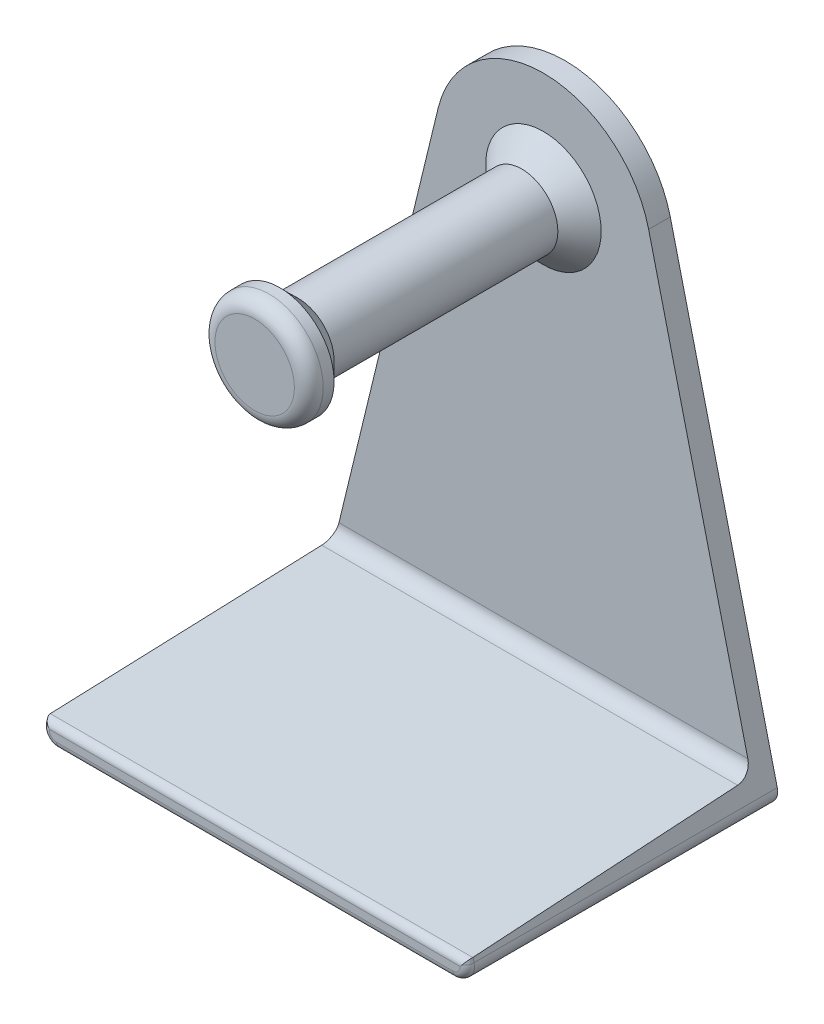
ISO-10303-21;
HEADER;
FILE_DESCRIPTION(('STEP AP214'),'2;1');
FILE_NAME('part.step','',(''),(''),'','','');
FILE_SCHEMA(('AUTOMOTIVE_DESIGN { 1 0 10303 214 1 1 1 1 }'));
ENDSEC;
DATA;
#1=APPLICATION_CONTEXT('core data for automotive mechanical design processes');
#2=APPLICATION_PROTOCOL_DEFINITION('international standard','automotive_design',2000,#1);
#3=PRODUCT_CONTEXT('',#1,'mechanical');
#4=PRODUCT('Part','Part','',(#3));
#5=PRODUCT_RELATED_PRODUCT_CATEGORY('part','',(#4));
#6=PRODUCT_DEFINITION_FORMATION('','',#4);
#7=PRODUCT_DEFINITION_CONTEXT('part definition',#1,'design');
#8=PRODUCT_DEFINITION('design','',#6,#7);
#9=PRODUCT_DEFINITION_SHAPE('','',#8);
#10=(LENGTH_UNIT() NAMED_UNIT(*) SI_UNIT(.MILLI.,.METRE.));
#11=(NAMED_UNIT(*) PLANE_ANGLE_UNIT() SI_UNIT($,.RADIAN.));
#12=(NAMED_UNIT(*) SI_UNIT($,.STERADIAN.) SOLID_ANGLE_UNIT());
#13=UNCERTAINTY_MEASURE_WITH_UNIT(LENGTH_MEASURE(1.E-05),#10,'distance_accuracy_value','');
#14=(GEOMETRIC_REPRESENTATION_CONTEXT(3) GLOBAL_UNCERTAINTY_ASSIGNED_CONTEXT((#13)) GLOBAL_UNIT_ASSIGNED_CONTEXT((#10,
#11,#12)) REPRESENTATION_CONTEXT('',''));
#15=CARTESIAN_POINT('',(0.,0.,0.));
#16=DIRECTION('',(0.,0.,1.));
#17=DIRECTION('',(1.,0.,0.));
#18=AXIS2_PLACEMENT_3D('',#15,#16,#17);
#19=CARTESIAN_POINT('',(30.,-57.,43.));
#20=DIRECTION('',(0.,-0.998752338877845,-0.0499376169438923));
#21=DIRECTION('',(0.,0.0499376169438923,-0.998752338877845));
#22=AXIS2_PLACEMENT_3D('',#19,#20,#21);
#23=PLANE('',#22);
#24=DIRECTION('',(-1.,0.,0.));
#25=VECTOR('',#24,1.);
#26=CARTESIAN_POINT('',(29.2717797887081,-56.9524968808472,42.0499376169439));
#27=LINE('',#26,#25);
#28=CARTESIAN_POINT('',(-29.2589649853697,-56.9524968808472,42.0499376169439));
#29=VERTEX_POINT('',#28);
#30=CARTESIAN_POINT('',(29.2589649853697,-56.9524968808472,42.0499376169439));
#31=VERTEX_POINT('',#30);
#32=EDGE_CURVE('E276',#29,#31,#27,.F.);
#33=ORIENTED_EDGE('',*,*,#32,.T.);
#34=CARTESIAN_POINT('',(28.2306030669091,-56.95,42.));
#35=DIRECTION('',(0.,-0.998752338877845,-0.0499376169438923));
#36=DIRECTION('',(0.979487540364529,-0.0100626662741666,0.201253325483332));
#37=AXIS2_PLACEMENT_3D('',#34,#35,#36);
#38=ELLIPSE('',#37,1.03032521499143,1.);
#39=CARTESIAN_POINT('',(29.2596427851866,-56.95,42.));
#40=VERTEX_POINT('',#39);
#41=EDGE_CURVE('E282',#31,#40,#38,.F.);
#42=ORIENTED_EDGE('',*,*,#41,.T.);
#43=DIRECTION('',(0.0121209701621265,-0.0499339484437978,0.998678968875955));
#44=VECTOR('',#43,1.);
#45=CARTESIAN_POINT('',(29.2718867773052,-57.000440753753,43.0088150750603));
#46=LINE('',#45,#44);
#47=CARTESIAN_POINT('',(28.8093614688246,-55.0950062383056,4.90012476611221));
#48=VERTEX_POINT('',#47);
#49=EDGE_CURVE('E244',#48,#40,#46,.T.);
#50=ORIENTED_EDGE('',*,*,#49,.F.);
#51=DIRECTION('',(-1.,0.,0.));
#52=VECTOR('',#51,1.);
#53=CARTESIAN_POINT('',(30.,-55.0950062383056,4.90012476611221));
#54=LINE('',#53,#52);
#55=CARTESIAN_POINT('',(-28.8093614688245,-55.0950062383056,4.90012476611221));
#56=VERTEX_POINT('',#55);
#57=EDGE_CURVE('E252',#48,#56,#54,.T.);
#58=ORIENTED_EDGE('',*,*,#57,.T.);
#59=DIRECTION('',(-0.0121209701621265,-0.0499339484437978,0.998678968875955));
#60=VECTOR('',#59,1.);
#61=CARTESIAN_POINT('',(-29.2630717022449,-56.9641258798031,42.2825175960629));
#62=LINE('',#61,#60);
#63=CARTESIAN_POINT('',(-29.2596427851866,-56.95,42.));
#64=VERTEX_POINT('',#63);
#65=EDGE_CURVE('E248',#56,#64,#62,.T.);
#66=ORIENTED_EDGE('',*,*,#65,.T.);
#67=CARTESIAN_POINT('',(-28.2306030669091,-56.95,42.));
#68=DIRECTION('',(0.,-0.998752338877845,-0.0499376169438923));
#69=DIRECTION('',(0.979487540364529,0.0100626662741666,-0.201253325483333));
#70=AXIS2_PLACEMENT_3D('',#67,#68,#69);
#71=ELLIPSE('',#70,1.03032521499143,1.);
#72=EDGE_CURVE('E279',#64,#29,#71,.F.);
#73=ORIENTED_EDGE('',*,*,#72,.T.);
#74=EDGE_LOOP('',(#33,#42,#50,#58,#66,#73));
#75=FACE_BOUND('',#74,.T.);
#76=ADVANCED_FACE('F78',(#75),#23,.F.);
#77=CARTESIAN_POINT('',(-27.4564404225837,-58.,3.));
#78=DIRECTION('',(0.,0.,1.));
#79=DIRECTION('',(1.,0.,0.));
#80=AXIS2_PLACEMENT_3D('',#77,#78,#79);
#81=PLANE('',#80);
#82=CARTESIAN_POINT('',(0.,0.,3.));
#83=DIRECTION('',(0.,0.,1.));
#84=DIRECTION('',(1.,0.,0.));
#85=AXIS2_PLACEMENT_3D('',#82,#83,#84);
#86=CIRCLE('',#85,7.99999999999998);
#87=CARTESIAN_POINT('',(7.99999999999998,0.,3.));
#88=VERTEX_POINT('',#87);
#89=EDGE_CURVE('E236',#88,#88,#86,.F.);
#90=ORIENTED_EDGE('',*,*,#89,.T.);
#91=EDGE_LOOP('',(#90));
#92=FACE_BOUND('',#91,.T.);
#93=DIRECTION('',(-0.235889894354067,-0.971779788708135,0.));
#94=VECTOR('',#93,1.);
#95=CARTESIAN_POINT('',(-14.576696830622,3.53834841531101,3.));
#96=LINE('',#95,#94);
#97=CARTESIAN_POINT('',(-14.576696830622,3.53834841531101,3.));
#98=VERTEX_POINT('',#97);
#99=CARTESIAN_POINT('',(-28.3244870426606,-53.0975015605499,3.));
#100=VERTEX_POINT('',#99);
#101=EDGE_CURVE('E437',#98,#100,#96,.T.);
#102=ORIENTED_EDGE('',*,*,#101,.T.);
#103=DIRECTION('',(-1.,0.,0.));
#104=VECTOR('',#103,1.);
#105=CARTESIAN_POINT('',(-27.4564404225837,-53.0975015605499,3.));
#106=LINE('',#105,#104);
#107=CARTESIAN_POINT('',(28.3244870426606,-53.0975015605499,3.));
#108=VERTEX_POINT('',#107);
#109=EDGE_CURVE('E256',#100,#108,#106,.F.);
#110=ORIENTED_EDGE('',*,*,#109,.T.);
#111=DIRECTION('',(-0.235889894354067,0.971779788708135,0.));
#112=VECTOR('',#111,1.);
#113=CARTESIAN_POINT('',(14.576696830622,3.53834841531101,3.));
#114=LINE('',#113,#112);
#115=CARTESIAN_POINT('',(14.576696830622,3.53834841531101,3.));
#116=VERTEX_POINT('',#115);
#117=EDGE_CURVE('E410',#108,#116,#114,.T.);
#118=ORIENTED_EDGE('',*,*,#117,.T.);
#119=CARTESIAN_POINT('',(0.,0.,3.));
#120=DIRECTION('',(0.,0.,1.));
#121=DIRECTION('',(1.,0.,0.));
#122=AXIS2_PLACEMENT_3D('',#119,#120,#121);
#123=CIRCLE('',#122,15.);
#124=EDGE_CURVE('E444',#116,#98,#123,.T.);
#125=ORIENTED_EDGE('',*,*,#124,.T.);
#126=EDGE_LOOP('',(#102,#110,#118,#125));
#127=FACE_BOUND('',#126,.T.);
#128=ADVANCED_FACE('F337',(#92,#127),#81,.T.);
#129=CARTESIAN_POINT('',(0.,0.,43.));
#130=DIRECTION('',(0.,0.,-1.));
#131=DIRECTION('',(-1.,0.,0.));
#132=AXIS2_PLACEMENT_3D('',#129,#130,#131);
#133=CYLINDRICAL_SURFACE('',#132,5.);
#134=CARTESIAN_POINT('',(0.,0.,37.));
#135=DIRECTION('',(0.,0.,1.));
#136=DIRECTION('',(1.,0.,0.));
#137=AXIS2_PLACEMENT_3D('',#134,#135,#136);
#138=CIRCLE('',#137,5.);
#139=CARTESIAN_POINT('',(5.,0.,37.));
#140=VERTEX_POINT('',#139);
#141=EDGE_CURVE('E232',#140,#140,#138,.F.);
#142=ORIENTED_EDGE('',*,*,#141,.T.);
#143=EDGE_LOOP('',(#142));
#144=FACE_BOUND('',#143,.T.);
#145=CARTESIAN_POINT('',(0.,0.,6.00000000000001));
#146=DIRECTION('',(0.,0.,1.));
#147=DIRECTION('',(1.,0.,0.));
#148=AXIS2_PLACEMENT_3D('',#145,#146,#147);
#149=CIRCLE('',#148,5.);
#150=CARTESIAN_POINT('',(5.,0.,6.00000000000001));
#151=VERTEX_POINT('',#150);
#152=EDGE_CURVE('E223',#151,#151,#149,.T.);
#153=ORIENTED_EDGE('',*,*,#152,.T.);
#154=EDGE_LOOP('',(#153));
#155=FACE_BOUND('',#154,.T.);
#156=ADVANCED_FACE('F345',(#144,#155),#133,.T.);
#157=CARTESIAN_POINT('',(-27.4564404225837,-58.,3.));
#158=DIRECTION('',(0.,0.,-1.));
#159=DIRECTION('',(-1.,0.,0.));
#160=AXIS2_PLACEMENT_3D('',#157,#158,#159);
#161=CYLINDRICAL_SURFACE('',#160,2.);
#162=DIRECTION('',(0.,0.,-1.));
#163=VECTOR('',#162,1.);
#164=CARTESIAN_POINT('',(-27.4564404225837,-60.,3.));
#165=LINE('',#164,#163);
#166=CARTESIAN_POINT('',(-27.4564404225837,-60.,42.));
#167=VERTEX_POINT('',#166);
#168=CARTESIAN_POINT('',(-27.4564404225837,-60.,0.));
#169=VERTEX_POINT('',#168);
#170=EDGE_CURVE('E123',#167,#169,#165,.T.);
#171=ORIENTED_EDGE('',*,*,#170,.F.);
#172=CARTESIAN_POINT('',(-27.4564404225837,-58.,42.));
#173=DIRECTION('',(0.,0.,1.));
#174=DIRECTION('',(1.,0.,0.));
#175=AXIS2_PLACEMENT_3D('',#172,#173,#174);
#176=CIRCLE('',#175,2.);
#177=CARTESIAN_POINT('',(-29.4,-57.5282202112919,42.));
#178=VERTEX_POINT('',#177);
#179=EDGE_CURVE('E96',#167,#178,#176,.F.);
#180=ORIENTED_EDGE('',*,*,#179,.T.);
#181=DIRECTION('',(0.,0.,-1.));
#182=VECTOR('',#181,1.);
#183=CARTESIAN_POINT('',(-29.4,-57.5282202112919,3.));
#184=LINE('',#183,#182);
#185=CARTESIAN_POINT('',(-29.4,-57.5282202112919,0.));
#186=VERTEX_POINT('',#185);
#187=EDGE_CURVE('E433',#178,#186,#184,.T.);
#188=ORIENTED_EDGE('',*,*,#187,.T.);
#189=CARTESIAN_POINT('',(-27.4564404225837,-58.,0.));
#190=DIRECTION('',(0.,0.,1.));
#191=DIRECTION('',(1.,0.,0.));
#192=AXIS2_PLACEMENT_3D('',#189,#190,#191);
#193=CIRCLE('',#192,2.);
#194=EDGE_CURVE('E454',#186,#169,#193,.T.);
#195=ORIENTED_EDGE('',*,*,#194,.T.);
#196=EDGE_LOOP('',(#171,#180,#188,#195));
#197=FACE_BOUND('',#196,.T.);
#198=ADVANCED_FACE('F365',(#197),#161,.T.);
#199=CARTESIAN_POINT('',(-27.4564404225837,-60.,3.));
#200=DIRECTION('',(0.,1.,0.));
#201=DIRECTION('',(-1.,0.,0.));
#202=AXIS2_PLACEMENT_3D('',#199,#200,#201);
#203=PLANE('',#202);
#204=DIRECTION('',(0.,0.,-1.));
#205=VECTOR('',#204,1.);
#206=CARTESIAN_POINT('',(27.4564404225837,-60.,3.));
#207=LINE('',#206,#205);
#208=CARTESIAN_POINT('',(27.4564404225837,-60.,42.));
#209=VERTEX_POINT('',#208);
#210=CARTESIAN_POINT('',(27.4564404225837,-60.,0.));
#211=VERTEX_POINT('',#210);
#212=EDGE_CURVE('E211',#209,#211,#207,.T.);
#213=ORIENTED_EDGE('',*,*,#212,.F.);
#214=DIRECTION('',(1.,0.,0.));
#215=VECTOR('',#214,1.);
#216=CARTESIAN_POINT('',(-27.4564404225837,-60.,42.));
#217=LINE('',#216,#215);
#218=EDGE_CURVE('E200',#209,#167,#217,.F.);
#219=ORIENTED_EDGE('',*,*,#218,.T.);
#220=ORIENTED_EDGE('',*,*,#170,.T.);
#221=DIRECTION('',(1.,0.,0.));
#222=VECTOR('',#221,1.);
#223=CARTESIAN_POINT('',(-27.4564404225837,-60.,0.));
#224=LINE('',#223,#222);
#225=EDGE_CURVE('E217',#169,#211,#224,.T.);
#226=ORIENTED_EDGE('',*,*,#225,.T.);
#227=EDGE_LOOP('',(#213,#219,#220,#226));
#228=FACE_BOUND('',#227,.T.);
#229=ADVANCED_FACE('F216',(#228),#203,.F.);
#230=CARTESIAN_POINT('',(27.4564404225837,-58.,3.));
#231=DIRECTION('',(0.,0.,-1.));
#232=DIRECTION('',(-1.,0.,0.));
#233=AXIS2_PLACEMENT_3D('',#230,#231,#232);
#234=CYLINDRICAL_SURFACE('',#233,2.);
#235=DIRECTION('',(0.,0.,-1.));
#236=VECTOR('',#235,1.);
#237=CARTESIAN_POINT('',(29.4,-57.5282202112919,3.));
#238=LINE('',#237,#236);
#239=CARTESIAN_POINT('',(29.4,-57.5282202112919,42.));
#240=VERTEX_POINT('',#239);
#241=CARTESIAN_POINT('',(29.4,-57.5282202112919,0.));
#242=VERTEX_POINT('',#241);
#243=EDGE_CURVE('E212',#240,#242,#238,.T.);
#244=ORIENTED_EDGE('',*,*,#243,.F.);
#245=CARTESIAN_POINT('',(27.4564404225837,-58.,42.));
#246=DIRECTION('',(0.,0.,1.));
#247=DIRECTION('',(1.,0.,0.));
#248=AXIS2_PLACEMENT_3D('',#245,#246,#247);
#249=CIRCLE('',#248,2.);
#250=EDGE_CURVE('E191',#240,#209,#249,.F.);
#251=ORIENTED_EDGE('',*,*,#250,.T.);
#252=ORIENTED_EDGE('',*,*,#212,.T.);
#253=CARTESIAN_POINT('',(27.4564404225837,-58.,0.));
#254=DIRECTION('',(0.,0.,1.));
#255=DIRECTION('',(-1.,0.,0.));
#256=AXIS2_PLACEMENT_3D('',#253,#254,#255);
#257=CIRCLE('',#256,2.);
#258=EDGE_CURVE('E416',#211,#242,#257,.T.);
#259=ORIENTED_EDGE('',*,*,#258,.T.);
#260=EDGE_LOOP('',(#244,#251,#252,#259));
#261=FACE_BOUND('',#260,.T.);
#262=ADVANCED_FACE('F209',(#261),#234,.T.);
#263=CARTESIAN_POINT('',(14.576696830622,3.53834841531101,3.));
#264=DIRECTION('',(-0.971779788708135,-0.235889894354067,0.));
#265=DIRECTION('',(0.235889894354067,-0.971779788708135,0.));
#266=AXIS2_PLACEMENT_3D('',#263,#264,#265);
#267=PLANE('',#266);
#268=ORIENTED_EDGE('',*,*,#49,.T.);
#269=DIRECTION('',(-0.235889894354067,0.971779788708135,0.));
#270=VECTOR('',#269,1.);
#271=CARTESIAN_POINT('',(29.8584660633876,-59.4169321267751,42.));
#272=LINE('',#271,#270);
#273=EDGE_CURVE('E214',#40,#240,#272,.F.);
#274=ORIENTED_EDGE('',*,*,#273,.T.);
#275=ORIENTED_EDGE('',*,*,#243,.T.);
#276=DIRECTION('',(-0.235889894354067,0.971779788708135,0.));
#277=VECTOR('',#276,1.);
#278=CARTESIAN_POINT('',(14.576696830622,3.53834841531101,0.));
#279=LINE('',#278,#277);
#280=CARTESIAN_POINT('',(14.576696830622,3.53834841531101,0.));
#281=VERTEX_POINT('',#280);
#282=EDGE_CURVE('E414',#242,#281,#279,.T.);
#283=ORIENTED_EDGE('',*,*,#282,.T.);
#284=DIRECTION('',(0.,0.,-1.));
#285=VECTOR('',#284,1.);
#286=CARTESIAN_POINT('',(14.576696830622,3.53834841531101,3.));
#287=LINE('',#286,#285);
#288=EDGE_CURVE('E225',#116,#281,#287,.T.);
#289=ORIENTED_EDGE('',*,*,#288,.F.);
#290=ORIENTED_EDGE('',*,*,#117,.F.);
#291=CARTESIAN_POINT('',(28.3244870426606,-53.0975015605499,5.));
#292=DIRECTION('',(-0.971779788708135,-0.235889894354067,0.));
#293=DIRECTION('',(-0.235889894354067,0.971779788708135,0.));
#294=AXIS2_PLACEMENT_3D('',#291,#292,#293);
#295=ELLIPSE('',#294,2.05807943655503,2.);
#296=EDGE_CURVE('E262',#108,#48,#295,.T.);
#297=ORIENTED_EDGE('',*,*,#296,.T.);
#298=EDGE_LOOP('',(#268,#274,#275,#283,#289,#290,#297));
#299=FACE_BOUND('',#298,.T.);
#300=ADVANCED_FACE('F378',(#299),#267,.F.);
#301=CARTESIAN_POINT('',(0.,0.,3.));
#302=DIRECTION('',(0.,0.,-1.));
#303=DIRECTION('',(-1.,0.,0.));
#304=AXIS2_PLACEMENT_3D('',#301,#302,#303);
#305=CYLINDRICAL_SURFACE('',#304,15.);
#306=CARTESIAN_POINT('',(0.,0.,0.));
#307=DIRECTION('',(0.,0.,1.));
#308=DIRECTION('',(1.,0.,0.));
#309=AXIS2_PLACEMENT_3D('',#306,#307,#308);
#310=CIRCLE('',#309,15.);
#311=CARTESIAN_POINT('',(-14.576696830622,3.53834841531101,0.));
#312=VERTEX_POINT('',#311);
#313=EDGE_CURVE('E422',#281,#312,#310,.T.);
#314=ORIENTED_EDGE('',*,*,#313,.T.);
#315=DIRECTION('',(0.,0.,-1.));
#316=VECTOR('',#315,1.);
#317=CARTESIAN_POINT('',(-14.576696830622,3.53834841531101,3.));
#318=LINE('',#317,#316);
#319=EDGE_CURVE('E436',#98,#312,#318,.T.);
#320=ORIENTED_EDGE('',*,*,#319,.F.);
#321=ORIENTED_EDGE('',*,*,#124,.F.);
#322=ORIENTED_EDGE('',*,*,#288,.T.);
#323=EDGE_LOOP('',(#314,#320,#321,#322));
#324=FACE_BOUND('',#323,.T.);
#325=ADVANCED_FACE('F374',(#324),#305,.T.);
#326=CARTESIAN_POINT('',(-14.576696830622,3.53834841531101,3.));
#327=DIRECTION('',(0.971779788708135,-0.235889894354067,0.));
#328=DIRECTION('',(0.235889894354067,0.971779788708135,0.));
#329=AXIS2_PLACEMENT_3D('',#326,#327,#328);
#330=PLANE('',#329);
#331=ORIENTED_EDGE('',*,*,#187,.F.);
#332=DIRECTION('',(-0.235889894354067,-0.971779788708135,0.));
#333=VECTOR('',#332,1.);
#334=CARTESIAN_POINT('',(-29.4,-57.5282202112919,42.));
#335=LINE('',#334,#333);
#336=EDGE_CURVE('E289',#178,#64,#335,.F.);
#337=ORIENTED_EDGE('',*,*,#336,.T.);
#338=ORIENTED_EDGE('',*,*,#65,.F.);
#339=CARTESIAN_POINT('',(-28.3244870426606,-53.0975015605499,5.));
#340=DIRECTION('',(0.971779788708135,-0.235889894354067,0.));
#341=DIRECTION('',(-0.235889894354067,-0.971779788708135,0.));
#342=AXIS2_PLACEMENT_3D('',#339,#340,#341);
#343=ELLIPSE('',#342,2.05807943655503,2.);
#344=EDGE_CURVE('E259',#56,#100,#343,.T.);
#345=ORIENTED_EDGE('',*,*,#344,.T.);
#346=ORIENTED_EDGE('',*,*,#101,.F.);
#347=ORIENTED_EDGE('',*,*,#319,.T.);
#348=DIRECTION('',(-0.235889894354067,-0.971779788708135,0.));
#349=VECTOR('',#348,1.);
#350=CARTESIAN_POINT('',(-14.576696830622,3.53834841531101,0.));
#351=LINE('',#350,#349);
#352=EDGE_CURVE('E426',#312,#186,#351,.T.);
#353=ORIENTED_EDGE('',*,*,#352,.T.);
#354=EDGE_LOOP('',(#331,#337,#338,#345,#346,#347,#353));
#355=FACE_BOUND('',#354,.T.);
#356=ADVANCED_FACE('F370',(#355),#330,.F.);
#357=CARTESIAN_POINT('',(-27.4564404225837,-58.,0.));
#358=DIRECTION('',(0.,0.,1.));
#359=DIRECTION('',(1.,0.,0.));
#360=AXIS2_PLACEMENT_3D('',#357,#358,#359);
#361=PLANE('',#360);
#362=ORIENTED_EDGE('',*,*,#194,.F.);
#363=ORIENTED_EDGE('',*,*,#352,.F.);
#364=ORIENTED_EDGE('',*,*,#313,.F.);
#365=ORIENTED_EDGE('',*,*,#282,.F.);
#366=ORIENTED_EDGE('',*,*,#258,.F.);
#367=ORIENTED_EDGE('',*,*,#225,.F.);
#368=EDGE_LOOP('',(#362,#363,#364,#365,#366,#367));
#369=FACE_BOUND('',#368,.T.);
#370=ADVANCED_FACE('F358',(#369),#361,.F.);
#371=CARTESIAN_POINT('',(0.,0.,40.));
#372=DIRECTION('',(0.,0.,1.));
#373=DIRECTION('',(1.,0.,0.));
#374=AXIS2_PLACEMENT_3D('',#371,#372,#373);
#375=CYLINDRICAL_SURFACE('',#374,7.5);
#376=CARTESIAN_POINT('',(0.,0.,41.));
#377=DIRECTION('',(0.,0.,1.));
#378=DIRECTION('',(1.,0.,0.));
#379=AXIS2_PLACEMENT_3D('',#376,#377,#378);
#380=CIRCLE('',#379,7.5);
#381=CARTESIAN_POINT('',(7.5,0.,41.));
#382=VERTEX_POINT('',#381);
#383=EDGE_CURVE('E13',#382,#382,#380,.F.);
#384=ORIENTED_EDGE('',*,*,#383,.T.);
#385=EDGE_LOOP('',(#384));
#386=FACE_BOUND('',#385,.T.);
#387=CARTESIAN_POINT('',(0.,0.,39.5));
#388=DIRECTION('',(0.,0.,1.));
#389=DIRECTION('',(1.,0.,0.));
#390=AXIS2_PLACEMENT_3D('',#387,#388,#389);
#391=CIRCLE('',#390,7.5);
#392=CARTESIAN_POINT('',(7.49999999999999,0.,39.4999999999999));
#393=VERTEX_POINT('',#392);
#394=EDGE_CURVE('E240',#393,#393,#391,.T.);
#395=ORIENTED_EDGE('',*,*,#394,.T.);
#396=EDGE_LOOP('',(#395));
#397=FACE_BOUND('',#396,.T.);
#398=ADVANCED_FACE('F354',(#386,#397),#375,.T.);
#399=CARTESIAN_POINT('',(0.,0.,43.));
#400=DIRECTION('',(0.,0.,1.));
#401=DIRECTION('',(1.,0.,0.));
#402=AXIS2_PLACEMENT_3D('',#399,#400,#401);
#403=PLANE('',#402);
#404=CARTESIAN_POINT('',(0.,0.,43.));
#405=DIRECTION('',(0.,0.,1.));
#406=DIRECTION('',(1.,0.,0.));
#407=AXIS2_PLACEMENT_3D('',#404,#405,#406);
#408=CIRCLE('',#407,5.5);
#409=CARTESIAN_POINT('',(5.5,0.,43.));
#410=VERTEX_POINT('',#409);
#411=EDGE_CURVE('E88',#410,#410,#408,.T.);
#412=ORIENTED_EDGE('',*,*,#411,.T.);
#413=EDGE_LOOP('',(#412));
#414=FACE_BOUND('',#413,.T.);
#415=ADVANCED_FACE('F357',(#414),#403,.T.);
#416=CARTESIAN_POINT('',(0.,0.,40.));
#417=DIRECTION('',(0.,0.,1.));
#418=DIRECTION('',(1.,0.,0.));
#419=AXIS2_PLACEMENT_3D('',#416,#417,#418);
#420=CONICAL_SURFACE('',#419,8.00000000000005,0.785398163397453);
#421=CARTESIAN_POINT('',(5.,0.,37.));
#422=CARTESIAN_POINT('',(5.02604166666666,0.,37.0260416666666));
#423=CARTESIAN_POINT('',(5.05208333333333,0.,37.0520833333333));
#424=CARTESIAN_POINT('',(5.10416666666666,0.,37.1041666666666));
#425=CARTESIAN_POINT('',(5.13020833333333,0.,37.1302083333333));
#426=CARTESIAN_POINT('',(5.18229166666666,0.,37.1822916666666));
#427=CARTESIAN_POINT('',(5.20833333333333,0.,37.2083333333333));
#428=CARTESIAN_POINT('',(5.26041666666666,0.,37.2604166666666));
#429=CARTESIAN_POINT('',(5.28645833333333,0.,37.2864583333333));
#430=CARTESIAN_POINT('',(5.33854166666666,0.,37.3385416666666));
#431=CARTESIAN_POINT('',(5.36458333333333,0.,37.3645833333333));
#432=CARTESIAN_POINT('',(5.41666666666666,0.,37.4166666666666));
#433=CARTESIAN_POINT('',(5.44270833333333,0.,37.4427083333333));
#434=CARTESIAN_POINT('',(5.49479166666666,0.,37.4947916666666));
#435=CARTESIAN_POINT('',(5.52083333333333,0.,37.5208333333333));
#436=CARTESIAN_POINT('',(5.57291666666666,0.,37.5729166666666));
#437=CARTESIAN_POINT('',(5.59895833333333,0.,37.5989583333333));
#438=CARTESIAN_POINT('',(5.65104166666666,0.,37.6510416666666));
#439=CARTESIAN_POINT('',(5.67708333333333,0.,37.6770833333333));
#440=CARTESIAN_POINT('',(5.72916666666666,0.,37.7291666666666));
#441=CARTESIAN_POINT('',(5.75520833333333,0.,37.7552083333333));
#442=CARTESIAN_POINT('',(5.80729166666666,0.,37.8072916666666));
#443=CARTESIAN_POINT('',(5.83333333333333,0.,37.8333333333333));
#444=CARTESIAN_POINT('',(5.88541666666666,0.,37.8854166666666));
#445=CARTESIAN_POINT('',(5.91145833333333,0.,37.9114583333333));
#446=CARTESIAN_POINT('',(5.96354166666666,0.,37.9635416666666));
#447=CARTESIAN_POINT('',(5.98958333333333,0.,37.9895833333333));
#448=CARTESIAN_POINT('',(6.04166666666666,0.,38.0416666666666));
#449=CARTESIAN_POINT('',(6.06770833333333,0.,38.0677083333333));
#450=CARTESIAN_POINT('',(6.11979166666666,0.,38.1197916666666));
#451=CARTESIAN_POINT('',(6.14583333333333,0.,38.1458333333333));
#452=CARTESIAN_POINT('',(6.19791666666666,0.,38.1979166666666));
#453=CARTESIAN_POINT('',(6.22395833333333,0.,38.2239583333333));
#454=CARTESIAN_POINT('',(6.27604166666666,0.,38.2760416666666));
#455=CARTESIAN_POINT('',(6.30208333333333,0.,38.3020833333333));
#456=CARTESIAN_POINT('',(6.35416666666666,0.,38.3541666666666));
#457=CARTESIAN_POINT('',(6.38020833333333,0.,38.3802083333333));
#458=CARTESIAN_POINT('',(6.43229166666666,0.,38.4322916666666));
#459=CARTESIAN_POINT('',(6.45833333333333,0.,38.4583333333333));
#460=CARTESIAN_POINT('',(6.51041666666666,0.,38.5104166666666));
#461=CARTESIAN_POINT('',(6.53645833333333,0.,38.5364583333333));
#462=CARTESIAN_POINT('',(6.58854166666666,0.,38.5885416666666));
#463=CARTESIAN_POINT('',(6.61458333333333,0.,38.6145833333333));
#464=CARTESIAN_POINT('',(6.66666666666666,0.,38.6666666666666));
#465=CARTESIAN_POINT('',(6.69270833333333,0.,38.6927083333333));
#466=CARTESIAN_POINT('',(6.74479166666666,0.,38.7447916666666));
#467=CARTESIAN_POINT('',(6.77083333333333,0.,38.7708333333333));
#468=CARTESIAN_POINT('',(6.82291666666666,0.,38.8229166666666));
#469=CARTESIAN_POINT('',(6.84895833333333,0.,38.8489583333333));
#470=CARTESIAN_POINT('',(6.90104166666666,0.,38.9010416666666));
#471=CARTESIAN_POINT('',(6.92708333333333,0.,38.9270833333333));
#472=CARTESIAN_POINT('',(6.97916666666666,0.,38.9791666666666));
#473=CARTESIAN_POINT('',(7.00520833333333,0.,39.0052083333333));
#474=CARTESIAN_POINT('',(7.05729166666666,0.,39.0572916666666));
#475=CARTESIAN_POINT('',(7.08333333333333,0.,39.0833333333333));
#476=CARTESIAN_POINT('',(7.13541666666666,0.,39.1354166666666));
#477=CARTESIAN_POINT('',(7.16145833333333,0.,39.1614583333333));
#478=CARTESIAN_POINT('',(7.21354166666666,0.,39.2135416666666));
#479=CARTESIAN_POINT('',(7.23958333333333,0.,39.2395833333333));
#480=CARTESIAN_POINT('',(7.29166666666666,0.,39.2916666666666));
#481=CARTESIAN_POINT('',(7.31770833333333,0.,39.3177083333333));
#482=CARTESIAN_POINT('',(7.36979166666666,0.,39.3697916666666));
#483=CARTESIAN_POINT('',(7.39583333333333,0.,39.3958333333333));
#484=CARTESIAN_POINT('',(7.44791666666666,0.,39.4479166666666));
#485=CARTESIAN_POINT('',(7.47395833333333,0.,39.4739583333333));
#486=CARTESIAN_POINT('',(7.49999999999999,0.,39.5));
#487=B_SPLINE_CURVE_WITH_KNOTS('',3,(#421,#422,#423,#424,#425,#426,#427,#428,#429,#430,#431,
#432,#433,#434,#435,#436,#437,#438,#439,#440,#441,#442,#443,#444,#445,#446,#447,#448,#449,#450,
#451,#452,#453,#454,#455,#456,#457,#458,#459,#460,#461,#462,#463,#464,#465,#466,#467,#468,#469,
#470,#471,#472,#473,#474,#475,#476,#477,#478,#479,#480,#481,#482,#483,#484,#485,#486),
.UNSPECIFIED.,.F.,.F.,(4,2,2,2,2,2,2,2,2,2,2,2,2,2,2,2,2,2,2,2,2,2,2,2,2,2,2,2,2,2,2,2,4),(0.,
0.110485434560402,0.220970869120799,0.331456303681196,0.441941738241593,0.552427172801989,
0.662912607362386,0.773398041922783,0.88388347648318,0.994368911043581,1.10485434560398,
1.21533978016438,1.32582521472477,1.43631064928517,1.54679608384557,1.65728151840596,
1.76776695296636,1.87825238752676,1.98873782208716,2.09922325664756,2.20970869120795,
2.32019412576835,2.43067956032875,2.54116499488914,2.65165042944954,2.76213586400994,
2.87262129857034,2.98310673313073,3.09359216769113,3.20407760225153,3.31456303681192,
3.42504847137232,3.53553390593272),.UNSPECIFIED.);
#488=EDGE_CURVE('BSEAM362',#140,#393,#487,.T.);
#489=ORIENTED_EDGE('',*,*,#141,.F.);
#490=ORIENTED_EDGE('',*,*,#394,.F.);
#491=ORIENTED_EDGE('',*,*,#488,.T.);
#492=ORIENTED_EDGE('',*,*,#488,.F.);
#493=EDGE_LOOP('',(#489,#491,#490,#492));
#494=FACE_BOUND('',#493,.T.);
#495=ADVANCED_FACE('F362',(#494),#420,.T.);
#496=CARTESIAN_POINT('',(0.,0.,6.00000000000001));
#497=DIRECTION('',(0.,0.,-1.));
#498=DIRECTION('',(-1.,0.,0.));
#499=AXIS2_PLACEMENT_3D('',#496,#497,#498);
#500=CONICAL_SURFACE('',#499,5.,0.785398163397443);
#501=ORIENTED_EDGE('',*,*,#89,.F.);
#502=EDGE_LOOP('',(#501));
#503=FACE_BOUND('',#502,.T.);
#504=ORIENTED_EDGE('',*,*,#152,.F.);
#505=EDGE_LOOP('',(#504));
#506=FACE_BOUND('',#505,.T.);
#507=ADVANCED_FACE('F352',(#503,#506),#500,.T.);
#508=CARTESIAN_POINT('',(0.,0.,43.));
#509=DIRECTION('',(0.,0.,1.));
#510=DIRECTION('',(1.,0.,0.));
#511=AXIS2_PLACEMENT_3D('',#508,#509,#510);
#512=PLANE('',#511);
#513=DIRECTION('',(1.,0.,0.));
#514=VECTOR('',#513,1.);
#515=CARTESIAN_POINT('',(27.4564404225837,-59.,43.));
#516=LINE('',#515,#514);
#517=CARTESIAN_POINT('',(-27.4564404225837,-59.,43.));
#518=VERTEX_POINT('',#517);
#519=CARTESIAN_POINT('',(27.4564404225837,-59.,43.));
#520=VERTEX_POINT('',#519);
#521=EDGE_CURVE('E271',#518,#520,#516,.T.);
#522=ORIENTED_EDGE('',*,*,#521,.T.);
#523=CARTESIAN_POINT('',(27.4564404225837,-58.,43.));
#524=DIRECTION('',(0.,0.,1.));
#525=DIRECTION('',(1.,0.,0.));
#526=AXIS2_PLACEMENT_3D('',#523,#524,#525);
#527=CIRCLE('',#526,1.);
#528=CARTESIAN_POINT('',(28.4552513964034,-57.951249219725,43.));
#529=VERTEX_POINT('',#528);
#530=EDGE_CURVE('E193',#520,#529,#527,.T.);
#531=ORIENTED_EDGE('',*,*,#530,.T.);
#532=DIRECTION('',(-1.,0.,0.));
#533=VECTOR('',#532,1.);
#534=CARTESIAN_POINT('',(-29.2717797887081,-57.951249219725,43.));
#535=LINE('',#534,#533);
#536=CARTESIAN_POINT('',(-28.4552513964034,-57.951249219725,43.));
#537=VERTEX_POINT('',#536);
#538=EDGE_CURVE('E265',#529,#537,#535,.T.);
#539=ORIENTED_EDGE('',*,*,#538,.T.);
#540=CARTESIAN_POINT('',(-27.4564404225837,-58.,43.));
#541=DIRECTION('',(0.,0.,1.));
#542=DIRECTION('',(1.,0.,0.));
#543=AXIS2_PLACEMENT_3D('',#540,#541,#542);
#544=CIRCLE('',#543,1.);
#545=EDGE_CURVE('E268',#537,#518,#544,.T.);
#546=ORIENTED_EDGE('',*,*,#545,.T.);
#547=EDGE_LOOP('',(#522,#531,#539,#546));
#548=FACE_BOUND('',#547,.T.);
#549=ADVANCED_FACE('F349',(#548),#512,.T.);
#550=CARTESIAN_POINT('',(30.,-53.0975015605499,5.));
#551=DIRECTION('',(-1.,0.,0.));
#552=DIRECTION('',(0.,0.,1.));
#553=AXIS2_PLACEMENT_3D('',#550,#551,#552);
#554=CYLINDRICAL_SURFACE('',#553,2.);
#555=ORIENTED_EDGE('',*,*,#296,.F.);
#556=ORIENTED_EDGE('',*,*,#109,.F.);
#557=ORIENTED_EDGE('',*,*,#344,.F.);
#558=ORIENTED_EDGE('',*,*,#57,.F.);
#559=EDGE_LOOP('',(#555,#556,#557,#558));
#560=FACE_BOUND('',#559,.T.);
#561=ADVANCED_FACE('F330',(#560),#554,.F.);
#562=CARTESIAN_POINT('',(-27.4564404225837,-58.,42.));
#563=DIRECTION('',(0.,0.,1.));
#564=DIRECTION('',(1.,0.,0.));
#565=AXIS2_PLACEMENT_3D('',#562,#563,#564);
#566=TOROIDAL_SURFACE('',#565,1.,1.);
#567=CARTESIAN_POINT('',(-28.4282202112919,-57.7641101056459,42.));
#568=DIRECTION('',(0.235889894354066,0.971779788708135,0.));
#569=DIRECTION('',(-0.971779788708135,0.235889894354066,0.));
#570=AXIS2_PLACEMENT_3D('',#567,#568,#569);
#571=CIRCLE('',#570,1.);
#572=CARTESIAN_POINT('',(-28.6662199542544,-57.7063380312767,42.9695455171228));
#573=VERTEX_POINT('',#572);
#574=EDGE_CURVE('E116',#178,#573,#571,.T.);
#575=ORIENTED_EDGE('',*,*,#574,.F.);
#576=ORIENTED_EDGE('',*,*,#179,.F.);
#577=CARTESIAN_POINT('',(-27.4564404225837,-59.,42.));
#578=DIRECTION('',(1.,0.,0.));
#579=DIRECTION('',(0.,0.,-1.));
#580=AXIS2_PLACEMENT_3D('',#577,#578,#579);
#581=CIRCLE('',#580,1.);
#582=EDGE_CURVE('E203',#518,#167,#581,.T.);
#583=ORIENTED_EDGE('',*,*,#582,.F.);
#584=ORIENTED_EDGE('',*,*,#545,.F.);
#585=CARTESIAN_POINT('',(-28.6662199542544,-57.7063380312767,42.9695455171228));
#586=CARTESIAN_POINT('',(-28.6338968734489,-57.7474461556126,42.9799497586492));
#587=CARTESIAN_POINT('',(-28.6004315546218,-57.7883591501591,42.9874850129768));
#588=CARTESIAN_POINT('',(-28.5315145056403,-57.8687364746616,42.9974022963746));
#589=CARTESIAN_POINT('',(-28.4960747977298,-57.9082075704883,42.9998126224401));
#590=CARTESIAN_POINT('',(-28.4581592656777,-57.9481926228349,42.9999965181614));
#591=CARTESIAN_POINT('',(-28.4567061409293,-57.9497217397965,43.0000000191071));
#592=CARTESIAN_POINT('',(-28.4552513964034,-57.951249219725,43.));
#593=B_SPLINE_CURVE_WITH_KNOTS('',3,(#585,#586,#587,#588,#589,#590,#591,#592),.UNSPECIFIED.,.F.,
.F.,(4,2,2,4),(0.,0.159862735899931,0.318840481923041,0.325168813147115),.UNSPECIFIED.);
#594=EDGE_CURVE('E314',#573,#537,#593,.T.);
#595=ORIENTED_EDGE('',*,*,#594,.F.);
#596=EDGE_LOOP('',(#575,#576,#583,#584,#595));
#597=FACE_BOUND('',#596,.T.);
#598=ADVANCED_FACE('F325',(#597),#566,.T.);
#599=CARTESIAN_POINT('',(-13.6049170419139,3.30245852095694,42.));
#600=DIRECTION('',(0.235889894354067,0.971779788708135,0.));
#601=DIRECTION('',(-0.971779788708135,0.235889894354067,0.));
#602=AXIS2_PLACEMENT_3D('',#599,#600,#601);
#603=CYLINDRICAL_SURFACE('',#602,1.);
#604=ORIENTED_EDGE('',*,*,#336,.F.);
#605=ORIENTED_EDGE('',*,*,#574,.T.);
#606=CARTESIAN_POINT('',(-28.4736463730237,-57.951249219725,42.));
#607=DIRECTION('',(0.786094744402374,0.618106020697879,0.));
#608=DIRECTION('',(0.618106020697879,-0.786094744402374,0.));
#609=AXIS2_PLACEMENT_3D('',#606,#607,#608);
#610=ELLIPSE('',#609,1.27211129080916,1.);
#611=EDGE_CURVE('E323',#29,#573,#610,.T.);
#612=ORIENTED_EDGE('',*,*,#611,.F.);
#613=ORIENTED_EDGE('',*,*,#72,.F.);
#614=EDGE_LOOP('',(#604,#605,#612,#613));
#615=FACE_BOUND('',#614,.T.);
#616=ADVANCED_FACE('F329',(#615),#603,.T.);
#617=CARTESIAN_POINT('',(0.,-59.,42.));
#618=DIRECTION('',(-1.,0.,0.));
#619=DIRECTION('',(0.,-1.,0.));
#620=AXIS2_PLACEMENT_3D('',#617,#618,#619);
#621=CYLINDRICAL_SURFACE('',#620,1.);
#622=ORIENTED_EDGE('',*,*,#582,.T.);
#623=ORIENTED_EDGE('',*,*,#218,.F.);
#624=CARTESIAN_POINT('',(27.4564404225837,-59.,42.));
#625=DIRECTION('',(1.,0.,0.));
#626=DIRECTION('',(0.,0.,-1.));
#627=AXIS2_PLACEMENT_3D('',#624,#625,#626);
#628=CIRCLE('',#627,1.);
#629=EDGE_CURVE('E186',#520,#209,#628,.T.);
#630=ORIENTED_EDGE('',*,*,#629,.F.);
#631=ORIENTED_EDGE('',*,*,#521,.F.);
#632=EDGE_LOOP('',(#622,#623,#630,#631));
#633=FACE_BOUND('',#632,.T.);
#634=ADVANCED_FACE('F201',(#633),#621,.T.);
#635=CARTESIAN_POINT('',(0.,-57.951249219725,42.));
#636=DIRECTION('',(1.,0.,0.));
#637=DIRECTION('',(0.,0.,-1.));
#638=AXIS2_PLACEMENT_3D('',#635,#636,#637);
#639=CYLINDRICAL_SURFACE('',#638,1.);
#640=CARTESIAN_POINT('',(28.4736463730238,-57.951249219725,42.));
#641=DIRECTION('',(0.786094744402374,-0.618106020697879,0.));
#642=DIRECTION('',(0.618106020697878,0.786094744402374,0.));
#643=AXIS2_PLACEMENT_3D('',#640,#641,#642);
#644=ELLIPSE('',#643,1.27211129080916,1.);
#645=CARTESIAN_POINT('',(28.6662199542544,-57.7063380312767,42.9695455171228));
#646=VERTEX_POINT('',#645);
#647=EDGE_CURVE('E108',#31,#646,#644,.T.);
#648=ORIENTED_EDGE('',*,*,#647,.F.);
#649=ORIENTED_EDGE('',*,*,#32,.F.);
#650=ORIENTED_EDGE('',*,*,#611,.T.);
#651=ORIENTED_EDGE('',*,*,#594,.T.);
#652=ORIENTED_EDGE('',*,*,#538,.F.);
#653=CARTESIAN_POINT('',(28.6662199542544,-57.7063380312767,42.9695455171228));
#654=CARTESIAN_POINT('',(28.6338968734489,-57.7474461556125,42.9799497586492));
#655=CARTESIAN_POINT('',(28.6004315546218,-57.7883591501591,42.9874850129768));
#656=CARTESIAN_POINT('',(28.5315145056403,-57.8687364746616,42.9974022963746));
#657=CARTESIAN_POINT('',(28.4960747977298,-57.9082075704883,42.9998126224401));
#658=CARTESIAN_POINT('',(28.4581592656777,-57.9481926228349,42.9999965181614));
#659=CARTESIAN_POINT('',(28.4567061409293,-57.9497217397965,43.0000000191071));
#660=CARTESIAN_POINT('',(28.4552513964034,-57.951249219725,43.));
#661=B_SPLINE_CURVE_WITH_KNOTS('',3,(#653,#654,#655,#656,#657,#658,#659,#660),.UNSPECIFIED.,.F.,
.F.,(4,2,2,4),(0.,0.159862735899941,0.318840481923051,0.325168813147124),.UNSPECIFIED.);
#662=EDGE_CURVE('E197',#646,#529,#661,.T.);
#663=ORIENTED_EDGE('',*,*,#662,.F.);
#664=EDGE_LOOP('',(#648,#649,#650,#651,#652,#663));
#665=FACE_BOUND('',#664,.T.);
#666=ADVANCED_FACE('F305',(#665),#639,.T.);
#667=CARTESIAN_POINT('',(13.6049170419139,3.30245852095695,42.));
#668=DIRECTION('',(0.235889894354067,-0.971779788708135,0.));
#669=DIRECTION('',(0.971779788708135,0.235889894354067,0.));
#670=AXIS2_PLACEMENT_3D('',#667,#668,#669);
#671=CYLINDRICAL_SURFACE('',#670,1.);
#672=ORIENTED_EDGE('',*,*,#41,.F.);
#673=ORIENTED_EDGE('',*,*,#647,.T.);
#674=CARTESIAN_POINT('',(28.4282202112919,-57.7641101056459,42.));
#675=DIRECTION('',(0.235889894354066,-0.971779788708135,0.));
#676=DIRECTION('',(0.971779788708135,0.235889894354066,0.));
#677=AXIS2_PLACEMENT_3D('',#674,#675,#676);
#678=CIRCLE('',#677,1.);
#679=EDGE_CURVE('E292',#240,#646,#678,.T.);
#680=ORIENTED_EDGE('',*,*,#679,.F.);
#681=ORIENTED_EDGE('',*,*,#273,.F.);
#682=EDGE_LOOP('',(#672,#673,#680,#681));
#683=FACE_BOUND('',#682,.T.);
#684=ADVANCED_FACE('F309',(#683),#671,.T.);
#685=CARTESIAN_POINT('',(27.4564404225837,-58.,42.));
#686=DIRECTION('',(0.,0.,1.));
#687=DIRECTION('',(1.,0.,0.));
#688=AXIS2_PLACEMENT_3D('',#685,#686,#687);
#689=TOROIDAL_SURFACE('',#688,1.,1.);
#690=ORIENTED_EDGE('',*,*,#629,.T.);
#691=ORIENTED_EDGE('',*,*,#250,.F.);
#692=ORIENTED_EDGE('',*,*,#679,.T.);
#693=ORIENTED_EDGE('',*,*,#662,.T.);
#694=ORIENTED_EDGE('',*,*,#530,.F.);
#695=EDGE_LOOP('',(#690,#691,#692,#693,#694));
#696=FACE_BOUND('',#695,.T.);
#697=ADVANCED_FACE('F188',(#696),#689,.T.);
#698=CARTESIAN_POINT('',(0.,0.,41.));
#699=DIRECTION('',(0.,0.,1.));
#700=DIRECTION('',(1.,0.,0.));
#701=AXIS2_PLACEMENT_3D('',#698,#699,#700);
#702=TOROIDAL_SURFACE('',#701,5.5,2.);
#703=ORIENTED_EDGE('',*,*,#383,.F.);
#704=EDGE_LOOP('',(#703));
#705=FACE_BOUND('',#704,.T.);
#706=ORIENTED_EDGE('',*,*,#411,.F.);
#707=EDGE_LOOP('',(#706));
#708=FACE_BOUND('',#707,.T.);
#709=ADVANCED_FACE('F80',(#705,#708),#702,.T.);
#710=CLOSED_SHELL('',(#76,#128,#156,#198,#229,#262,#300,#325,#356,#370,#398,#415,#495,#507,#549,
#561,#598,#616,#634,#666,#684,#697,#709));
#711=MANIFOLD_SOLID_BREP('B2',#710);
#712=ADVANCED_BREP_SHAPE_REPRESENTATION('',(#18,#711),#14);
#713=SHAPE_DEFINITION_REPRESENTATION(#9,#712);
ENDSEC;
END-ISO-10303-21;
